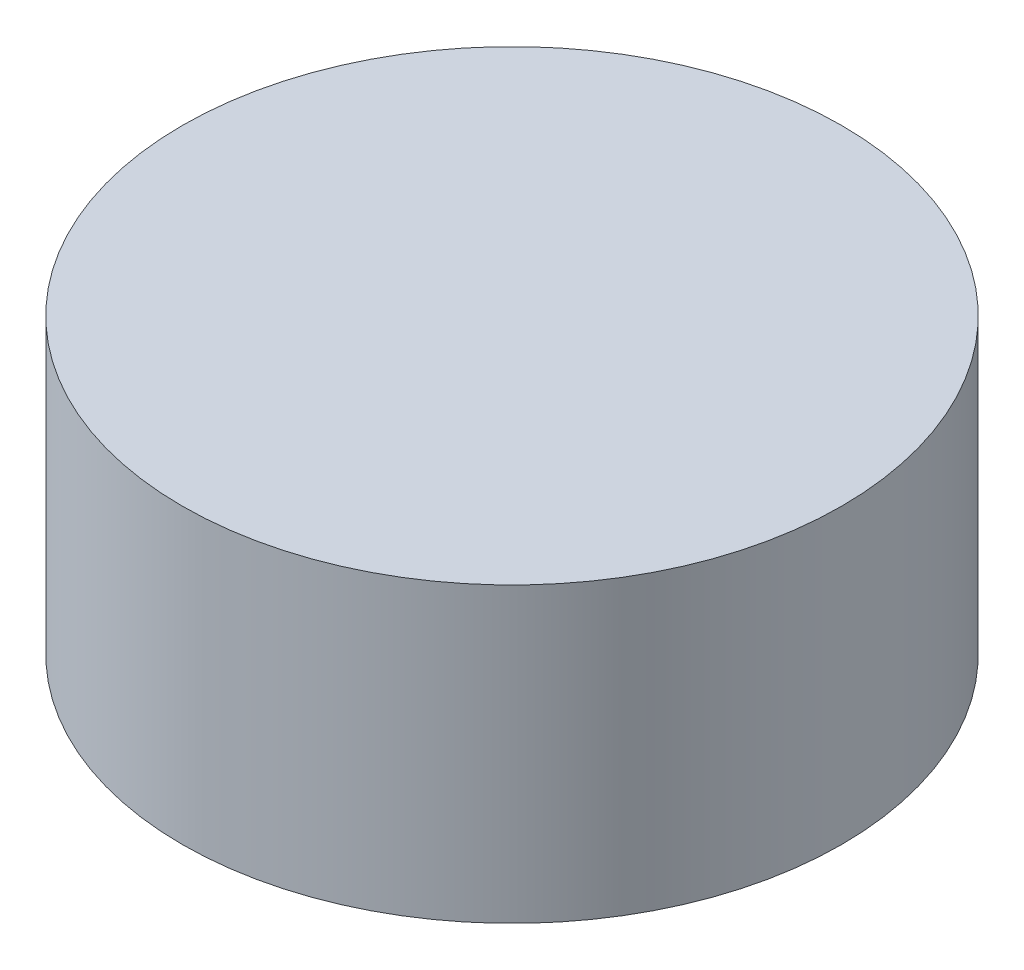
ISO-10303-21;
HEADER;
FILE_DESCRIPTION(('STEP AP214'),'2;1');
FILE_NAME('part.step','',(''),(''),'','','');
FILE_SCHEMA(('AUTOMOTIVE_DESIGN { 1 0 10303 214 1 1 1 1 }'));
ENDSEC;
DATA;
#1=APPLICATION_CONTEXT('core data for automotive mechanical design processes');
#2=APPLICATION_PROTOCOL_DEFINITION('international standard','automotive_design',2000,#1);
#3=PRODUCT_CONTEXT('',#1,'mechanical');
#4=PRODUCT('Part','Part','',(#3));
#5=PRODUCT_RELATED_PRODUCT_CATEGORY('part','',(#4));
#6=PRODUCT_DEFINITION_FORMATION('','',#4);
#7=PRODUCT_DEFINITION_CONTEXT('part definition',#1,'design');
#8=PRODUCT_DEFINITION('design','',#6,#7);
#9=PRODUCT_DEFINITION_SHAPE('','',#8);
#10=(LENGTH_UNIT() NAMED_UNIT(*) SI_UNIT(.MILLI.,.METRE.));
#11=(NAMED_UNIT(*) PLANE_ANGLE_UNIT() SI_UNIT($,.RADIAN.));
#12=(NAMED_UNIT(*) SI_UNIT($,.STERADIAN.) SOLID_ANGLE_UNIT());
#13=UNCERTAINTY_MEASURE_WITH_UNIT(LENGTH_MEASURE(1.E-05),#10,'distance_accuracy_value','');
#14=(GEOMETRIC_REPRESENTATION_CONTEXT(3) GLOBAL_UNCERTAINTY_ASSIGNED_CONTEXT((#13)) GLOBAL_UNIT_ASSIGNED_CONTEXT((#10,
#11,#12)) REPRESENTATION_CONTEXT('',''));
#15=CARTESIAN_POINT('',(0.,0.,0.));
#16=DIRECTION('',(0.,0.,1.));
#17=DIRECTION('',(1.,0.,0.));
#18=AXIS2_PLACEMENT_3D('',#15,#16,#17);
#19=CARTESIAN_POINT('',(0.,12.,0.));
#20=DIRECTION('',(0.,-1.,0.));
#21=DIRECTION('',(0.,0.,-1.));
#22=AXIS2_PLACEMENT_3D('',#19,#20,#21);
#23=CYLINDRICAL_SURFACE('',#22,13.5);
#24=CARTESIAN_POINT('',(0.,12.,0.));
#25=DIRECTION('',(0.,1.,0.));
#26=DIRECTION('',(0.,0.,1.));
#27=AXIS2_PLACEMENT_3D('',#24,#25,#26);
#28=CIRCLE('',#27,13.5);
#29=CARTESIAN_POINT('',(0.,12.,13.5));
#30=VERTEX_POINT('',#29);
#31=EDGE_CURVE('E10',#30,#30,#28,.T.);
#32=ORIENTED_EDGE('',*,*,#31,.F.);
#33=EDGE_LOOP('',(#32));
#34=FACE_BOUND('',#33,.T.);
#35=CARTESIAN_POINT('',(0.,0.,0.));
#36=DIRECTION('',(0.,1.,0.));
#37=DIRECTION('',(0.,0.,1.));
#38=AXIS2_PLACEMENT_3D('',#35,#36,#37);
#39=CIRCLE('',#38,13.5);
#40=CARTESIAN_POINT('',(0.,0.,13.5));
#41=VERTEX_POINT('',#40);
#42=EDGE_CURVE('E46',#41,#41,#39,.T.);
#43=ORIENTED_EDGE('',*,*,#42,.T.);
#44=EDGE_LOOP('',(#43));
#45=FACE_BOUND('',#44,.T.);
#46=ADVANCED_FACE('F43',(#34,#45),#23,.T.);
#47=CARTESIAN_POINT('',(0.,12.,0.));
#48=DIRECTION('',(0.,1.,0.));
#49=DIRECTION('',(0.,0.,1.));
#50=AXIS2_PLACEMENT_3D('',#47,#48,#49);
#51=PLANE('',#50);
#52=ORIENTED_EDGE('',*,*,#31,.T.);
#53=EDGE_LOOP('',(#52));
#54=FACE_BOUND('',#53,.T.);
#55=ADVANCED_FACE('F58',(#54),#51,.T.);
#56=CARTESIAN_POINT('',(0.,0.,0.));
#57=DIRECTION('',(0.,1.,0.));
#58=DIRECTION('',(0.,0.,1.));
#59=AXIS2_PLACEMENT_3D('',#56,#57,#58);
#60=PLANE('',#59);
#61=ORIENTED_EDGE('',*,*,#42,.F.);
#62=EDGE_LOOP('',(#61));
#63=FACE_BOUND('',#62,.T.);
#64=ADVANCED_FACE('F56',(#63),#60,.F.);
#65=CLOSED_SHELL('',(#46,#55,#64));
#66=MANIFOLD_SOLID_BREP('B2',#65);
#67=ADVANCED_BREP_SHAPE_REPRESENTATION('',(#18,#66),#14);
#68=SHAPE_DEFINITION_REPRESENTATION(#9,#67);
ENDSEC;
END-ISO-10303-21;
